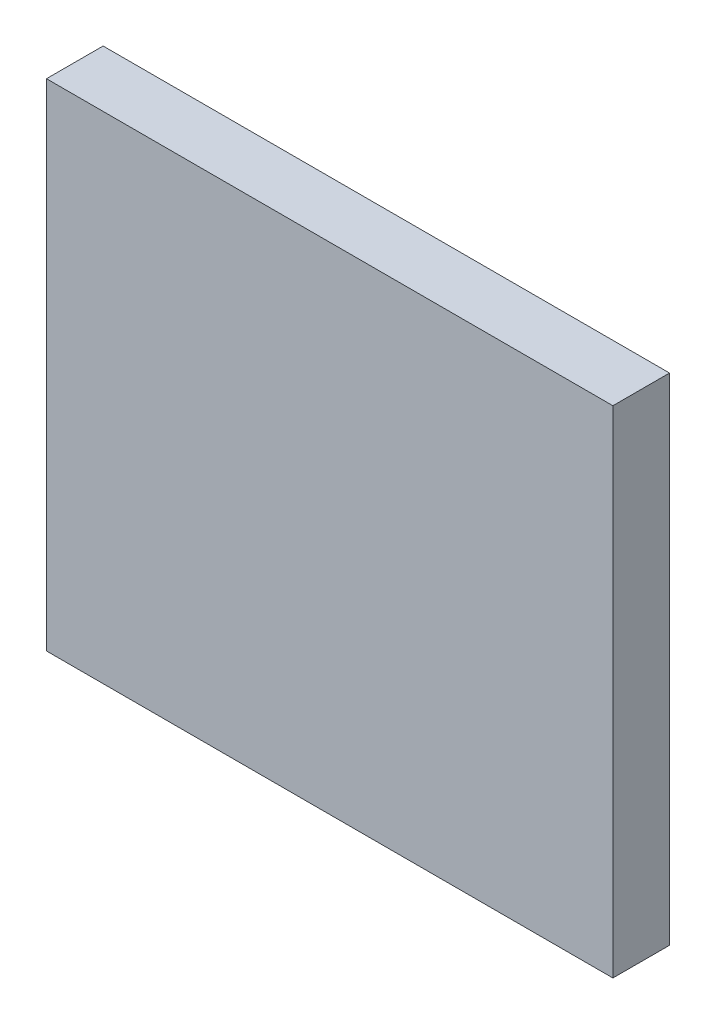
ISO-10303-21;
HEADER;
FILE_DESCRIPTION(('STEP AP214'),'2;1');
FILE_NAME('part.step','',(''),(''),'','','');
FILE_SCHEMA(('AUTOMOTIVE_DESIGN { 1 0 10303 214 1 1 1 1 }'));
ENDSEC;
DATA;
#1=APPLICATION_CONTEXT('core data for automotive mechanical design processes');
#2=APPLICATION_PROTOCOL_DEFINITION('international standard','automotive_design',2000,#1);
#3=PRODUCT_CONTEXT('',#1,'mechanical');
#4=PRODUCT('Part','Part','',(#3));
#5=PRODUCT_RELATED_PRODUCT_CATEGORY('part','',(#4));
#6=PRODUCT_DEFINITION_FORMATION('','',#4);
#7=PRODUCT_DEFINITION_CONTEXT('part definition',#1,'design');
#8=PRODUCT_DEFINITION('design','',#6,#7);
#9=PRODUCT_DEFINITION_SHAPE('','',#8);
#10=(LENGTH_UNIT() NAMED_UNIT(*) SI_UNIT(.MILLI.,.METRE.));
#11=(NAMED_UNIT(*) PLANE_ANGLE_UNIT() SI_UNIT($,.RADIAN.));
#12=(NAMED_UNIT(*) SI_UNIT($,.STERADIAN.) SOLID_ANGLE_UNIT());
#13=UNCERTAINTY_MEASURE_WITH_UNIT(LENGTH_MEASURE(1.E-05),#10,'distance_accuracy_value','');
#14=(GEOMETRIC_REPRESENTATION_CONTEXT(3) GLOBAL_UNCERTAINTY_ASSIGNED_CONTEXT((#13)) GLOBAL_UNIT_ASSIGNED_CONTEXT((#10,
#11,#12)) REPRESENTATION_CONTEXT('',''));
#15=CARTESIAN_POINT('',(0.,0.,0.));
#16=DIRECTION('',(0.,0.,1.));
#17=DIRECTION('',(1.,0.,0.));
#18=AXIS2_PLACEMENT_3D('',#15,#16,#17);
#19=CARTESIAN_POINT('',(0.,0.,4.));
#20=DIRECTION('',(1.,0.,0.));
#21=DIRECTION('',(0.,0.,-1.));
#22=AXIS2_PLACEMENT_3D('',#19,#20,#21);
#23=PLANE('',#22);
#24=DIRECTION('',(0.,-1.,0.));
#25=VECTOR('',#24,1.);
#26=CARTESIAN_POINT('',(0.,0.,0.));
#27=LINE('',#26,#25);
#28=CARTESIAN_POINT('',(0.,35.,0.));
#29=VERTEX_POINT('',#28);
#30=CARTESIAN_POINT('',(0.,0.,0.));
#31=VERTEX_POINT('',#30);
#32=EDGE_CURVE('E108',#29,#31,#27,.T.);
#33=ORIENTED_EDGE('',*,*,#32,.T.);
#34=DIRECTION('',(0.,0.,-1.));
#35=VECTOR('',#34,1.);
#36=CARTESIAN_POINT('',(0.,0.,4.));
#37=LINE('',#36,#35);
#38=CARTESIAN_POINT('',(0.,0.,4.));
#39=VERTEX_POINT('',#38);
#40=EDGE_CURVE('E11',#39,#31,#37,.T.);
#41=ORIENTED_EDGE('',*,*,#40,.F.);
#42=DIRECTION('',(0.,-1.,0.));
#43=VECTOR('',#42,1.);
#44=CARTESIAN_POINT('',(0.,0.,4.));
#45=LINE('',#44,#43);
#46=CARTESIAN_POINT('',(0.,35.,4.));
#47=VERTEX_POINT('',#46);
#48=EDGE_CURVE('E92',#47,#39,#45,.T.);
#49=ORIENTED_EDGE('',*,*,#48,.F.);
#50=DIRECTION('',(0.,0.,-1.));
#51=VECTOR('',#50,1.);
#52=CARTESIAN_POINT('',(0.,35.,4.));
#53=LINE('',#52,#51);
#54=EDGE_CURVE('E105',#47,#29,#53,.T.);
#55=ORIENTED_EDGE('',*,*,#54,.T.);
#56=EDGE_LOOP('',(#33,#41,#49,#55));
#57=FACE_BOUND('',#56,.T.);
#58=ADVANCED_FACE('F43',(#57),#23,.F.);
#59=CARTESIAN_POINT('',(0.,0.,4.));
#60=DIRECTION('',(0.,1.,0.));
#61=DIRECTION('',(0.,0.,1.));
#62=AXIS2_PLACEMENT_3D('',#59,#60,#61);
#63=PLANE('',#62);
#64=DIRECTION('',(1.,0.,0.));
#65=VECTOR('',#64,1.);
#66=CARTESIAN_POINT('',(0.,0.,0.));
#67=LINE('',#66,#65);
#68=CARTESIAN_POINT('',(40.,0.,0.));
#69=VERTEX_POINT('',#68);
#70=EDGE_CURVE('E97',#31,#69,#67,.T.);
#71=ORIENTED_EDGE('',*,*,#70,.T.);
#72=DIRECTION('',(0.,0.,-1.));
#73=VECTOR('',#72,1.);
#74=CARTESIAN_POINT('',(40.,0.,4.));
#75=LINE('',#74,#73);
#76=CARTESIAN_POINT('',(40.,0.,4.));
#77=VERTEX_POINT('',#76);
#78=EDGE_CURVE('E51',#77,#69,#75,.T.);
#79=ORIENTED_EDGE('',*,*,#78,.F.);
#80=DIRECTION('',(1.,0.,0.));
#81=VECTOR('',#80,1.);
#82=CARTESIAN_POINT('',(0.,0.,4.));
#83=LINE('',#82,#81);
#84=EDGE_CURVE('E87',#39,#77,#83,.T.);
#85=ORIENTED_EDGE('',*,*,#84,.F.);
#86=ORIENTED_EDGE('',*,*,#40,.T.);
#87=EDGE_LOOP('',(#71,#79,#85,#86));
#88=FACE_BOUND('',#87,.T.);
#89=ADVANCED_FACE('F100',(#88),#63,.F.);
#90=CARTESIAN_POINT('',(40.,0.,4.));
#91=DIRECTION('',(-1.,0.,0.));
#92=DIRECTION('',(0.,0.,1.));
#93=AXIS2_PLACEMENT_3D('',#90,#91,#92);
#94=PLANE('',#93);
#95=DIRECTION('',(0.,1.,0.));
#96=VECTOR('',#95,1.);
#97=CARTESIAN_POINT('',(40.,0.,0.));
#98=LINE('',#97,#96);
#99=CARTESIAN_POINT('',(40.,35.,0.));
#100=VERTEX_POINT('',#99);
#101=EDGE_CURVE('E78',#69,#100,#98,.T.);
#102=ORIENTED_EDGE('',*,*,#101,.T.);
#103=DIRECTION('',(0.,0.,-1.));
#104=VECTOR('',#103,1.);
#105=CARTESIAN_POINT('',(40.,35.,4.));
#106=LINE('',#105,#104);
#107=CARTESIAN_POINT('',(40.,35.,4.));
#108=VERTEX_POINT('',#107);
#109=EDGE_CURVE('E98',#108,#100,#106,.T.);
#110=ORIENTED_EDGE('',*,*,#109,.F.);
#111=DIRECTION('',(0.,1.,0.));
#112=VECTOR('',#111,1.);
#113=CARTESIAN_POINT('',(40.,0.,4.));
#114=LINE('',#113,#112);
#115=EDGE_CURVE('E95',#77,#108,#114,.T.);
#116=ORIENTED_EDGE('',*,*,#115,.F.);
#117=ORIENTED_EDGE('',*,*,#78,.T.);
#118=EDGE_LOOP('',(#102,#110,#116,#117));
#119=FACE_BOUND('',#118,.T.);
#120=ADVANCED_FACE('F99',(#119),#94,.F.);
#121=CARTESIAN_POINT('',(0.,35.,4.));
#122=DIRECTION('',(0.,-1.,0.));
#123=DIRECTION('',(0.,0.,-1.));
#124=AXIS2_PLACEMENT_3D('',#121,#122,#123);
#125=PLANE('',#124);
#126=DIRECTION('',(-1.,0.,0.));
#127=VECTOR('',#126,1.);
#128=CARTESIAN_POINT('',(0.,35.,0.));
#129=LINE('',#128,#127);
#130=EDGE_CURVE('E85',#100,#29,#129,.T.);
#131=ORIENTED_EDGE('',*,*,#130,.T.);
#132=ORIENTED_EDGE('',*,*,#54,.F.);
#133=DIRECTION('',(-1.,0.,0.));
#134=VECTOR('',#133,1.);
#135=CARTESIAN_POINT('',(0.,35.,4.));
#136=LINE('',#135,#134);
#137=EDGE_CURVE('E56',#108,#47,#136,.T.);
#138=ORIENTED_EDGE('',*,*,#137,.F.);
#139=ORIENTED_EDGE('',*,*,#109,.T.);
#140=EDGE_LOOP('',(#131,#132,#138,#139));
#141=FACE_BOUND('',#140,.T.);
#142=ADVANCED_FACE('F111',(#141),#125,.F.);
#143=CARTESIAN_POINT('',(0.,0.,4.));
#144=DIRECTION('',(0.,0.,-1.));
#145=DIRECTION('',(-1.,0.,0.));
#146=AXIS2_PLACEMENT_3D('',#143,#144,#145);
#147=PLANE('',#146);
#148=ORIENTED_EDGE('',*,*,#48,.T.);
#149=ORIENTED_EDGE('',*,*,#84,.T.);
#150=ORIENTED_EDGE('',*,*,#115,.T.);
#151=ORIENTED_EDGE('',*,*,#137,.T.);
#152=EDGE_LOOP('',(#148,#149,#150,#151));
#153=FACE_BOUND('',#152,.T.);
#154=ADVANCED_FACE('F89',(#153),#147,.F.);
#155=CARTESIAN_POINT('',(0.,0.,0.));
#156=DIRECTION('',(0.,0.,-1.));
#157=DIRECTION('',(-1.,0.,0.));
#158=AXIS2_PLACEMENT_3D('',#155,#156,#157);
#159=PLANE('',#158);
#160=ORIENTED_EDGE('',*,*,#32,.F.);
#161=ORIENTED_EDGE('',*,*,#130,.F.);
#162=ORIENTED_EDGE('',*,*,#101,.F.);
#163=ORIENTED_EDGE('',*,*,#70,.F.);
#164=EDGE_LOOP('',(#160,#161,#162,#163));
#165=FACE_BOUND('',#164,.T.);
#166=ADVANCED_FACE('F118',(#165),#159,.T.);
#167=CLOSED_SHELL('',(#58,#89,#120,#142,#154,#166));
#168=MANIFOLD_SOLID_BREP('B2',#167);
#169=ADVANCED_BREP_SHAPE_REPRESENTATION('',(#18,#168),#14);
#170=SHAPE_DEFINITION_REPRESENTATION(#9,#169);
ENDSEC;
END-ISO-10303-21;
